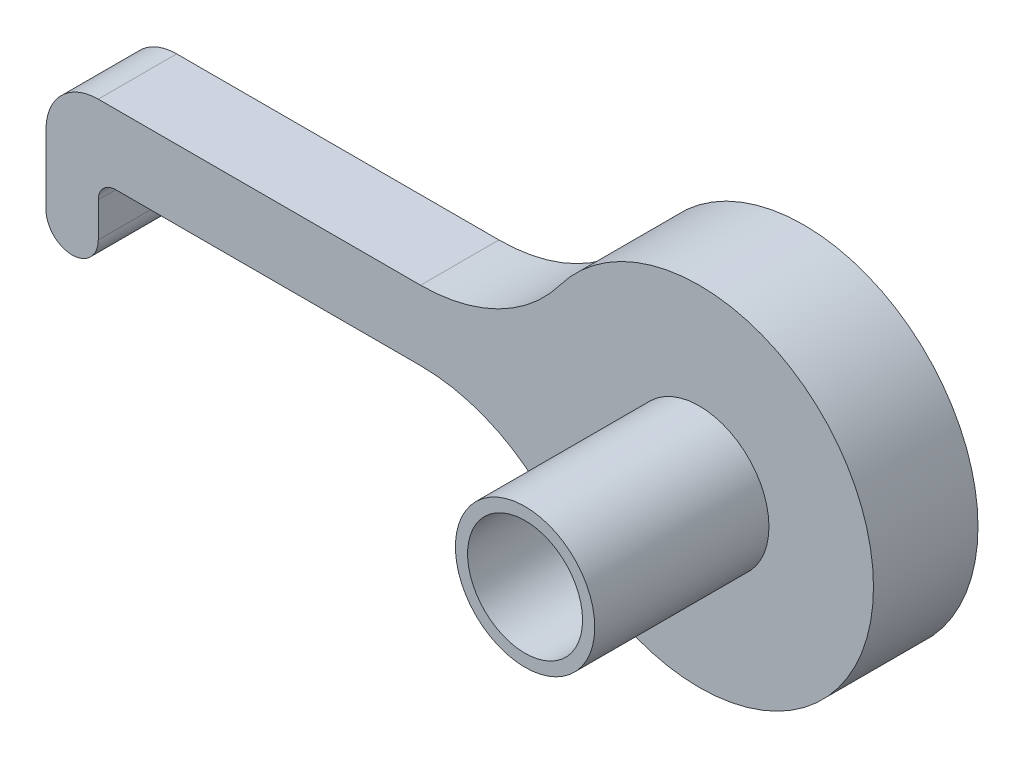
ISO-10303-21;
HEADER;
FILE_DESCRIPTION(('STEP AP214'),'2;1');
FILE_NAME('part.step','',(''),(''),'','','');
FILE_SCHEMA(('AUTOMOTIVE_DESIGN { 1 0 10303 214 1 1 1 1 }'));
ENDSEC;
DATA;
#1=APPLICATION_CONTEXT('core data for automotive mechanical design processes');
#2=APPLICATION_PROTOCOL_DEFINITION('international standard','automotive_design',2000,#1);
#3=PRODUCT_CONTEXT('',#1,'mechanical');
#4=PRODUCT('Part','Part','',(#3));
#5=PRODUCT_RELATED_PRODUCT_CATEGORY('part','',(#4));
#6=PRODUCT_DEFINITION_FORMATION('','',#4);
#7=PRODUCT_DEFINITION_CONTEXT('part definition',#1,'design');
#8=PRODUCT_DEFINITION('design','',#6,#7);
#9=PRODUCT_DEFINITION_SHAPE('','',#8);
#10=(LENGTH_UNIT() NAMED_UNIT(*) SI_UNIT(.MILLI.,.METRE.));
#11=(NAMED_UNIT(*) PLANE_ANGLE_UNIT() SI_UNIT($,.RADIAN.));
#12=(NAMED_UNIT(*) SI_UNIT($,.STERADIAN.) SOLID_ANGLE_UNIT());
#13=UNCERTAINTY_MEASURE_WITH_UNIT(LENGTH_MEASURE(1.E-05),#10,'distance_accuracy_value','');
#14=(GEOMETRIC_REPRESENTATION_CONTEXT(3) GLOBAL_UNCERTAINTY_ASSIGNED_CONTEXT((#13)) GLOBAL_UNIT_ASSIGNED_CONTEXT((#10,
#11,#12)) REPRESENTATION_CONTEXT('',''));
#15=CARTESIAN_POINT('',(0.,0.,0.));
#16=DIRECTION('',(0.,0.,1.));
#17=DIRECTION('',(1.,0.,0.));
#18=AXIS2_PLACEMENT_3D('',#15,#16,#17);
#19=CARTESIAN_POINT('',(0.,0.,6.));
#20=DIRECTION('',(0.,0.,-1.));
#21=DIRECTION('',(-1.,0.,0.));
#22=AXIS2_PLACEMENT_3D('',#19,#20,#21);
#23=CYLINDRICAL_SURFACE('',#22,10.);
#24=CARTESIAN_POINT('',(0.,0.,6.));
#25=DIRECTION('',(0.,0.,1.));
#26=DIRECTION('',(1.,0.,0.));
#27=AXIS2_PLACEMENT_3D('',#24,#25,#26);
#28=CIRCLE('',#27,10.);
#29=CARTESIAN_POINT('',(-8.,-6.,6.));
#30=VERTEX_POINT('',#29);
#31=CARTESIAN_POINT('',(-8.,6.,6.));
#32=VERTEX_POINT('',#31);
#33=EDGE_CURVE('E188',#30,#32,#28,.T.);
#34=ORIENTED_EDGE('',*,*,#33,.F.);
#35=DIRECTION('',(0.,0.,-1.));
#36=VECTOR('',#35,1.);
#37=CARTESIAN_POINT('',(-8.,-6.,6.));
#38=LINE('',#37,#36);
#39=CARTESIAN_POINT('',(-8.,-6.,1.5));
#40=VERTEX_POINT('',#39);
#41=EDGE_CURVE('E227',#30,#40,#38,.T.);
#42=ORIENTED_EDGE('',*,*,#41,.T.);
#43=CARTESIAN_POINT('',(0.,0.,1.5));
#44=DIRECTION('',(0.,0.,-1.));
#45=DIRECTION('',(1.,0.,0.));
#46=AXIS2_PLACEMENT_3D('',#43,#44,#45);
#47=CIRCLE('',#46,10.);
#48=CARTESIAN_POINT('',(-8.,6.,1.5));
#49=VERTEX_POINT('',#48);
#50=EDGE_CURVE('E165',#40,#49,#47,.T.);
#51=ORIENTED_EDGE('',*,*,#50,.T.);
#52=DIRECTION('',(0.,0.,-1.));
#53=VECTOR('',#52,1.);
#54=CARTESIAN_POINT('',(-8.,6.,6.));
#55=LINE('',#54,#53);
#56=EDGE_CURVE('E223',#49,#32,#55,.F.);
#57=ORIENTED_EDGE('',*,*,#56,.T.);
#58=EDGE_LOOP('',(#34,#42,#51,#57));
#59=FACE_BOUND('',#58,.T.);
#60=CARTESIAN_POINT('',(0.,0.,0.));
#61=DIRECTION('',(0.,0.,1.));
#62=DIRECTION('',(1.,0.,0.));
#63=AXIS2_PLACEMENT_3D('',#60,#61,#62);
#64=CIRCLE('',#63,10.);
#65=CARTESIAN_POINT('',(10.,0.,0.));
#66=VERTEX_POINT('',#65);
#67=EDGE_CURVE('E186',#66,#66,#64,.T.);
#68=ORIENTED_EDGE('',*,*,#67,.T.);
#69=EDGE_LOOP('',(#68));
#70=FACE_BOUND('',#69,.T.);
#71=ADVANCED_FACE('F45',(#59,#70),#23,.T.);
#72=CARTESIAN_POINT('',(0.,0.,6.));
#73=DIRECTION('',(0.,0.,1.));
#74=DIRECTION('',(1.,0.,0.));
#75=AXIS2_PLACEMENT_3D('',#72,#73,#74);
#76=PLANE('',#75);
#77=CARTESIAN_POINT('',(0.,0.,6.));
#78=DIRECTION('',(0.,0.,1.));
#79=DIRECTION('',(1.,0.,0.));
#80=AXIS2_PLACEMENT_3D('',#77,#78,#79);
#81=CIRCLE('',#80,4.);
#82=CARTESIAN_POINT('',(4.,0.,6.));
#83=VERTEX_POINT('',#82);
#84=EDGE_CURVE('E12',#83,#83,#81,.T.);
#85=ORIENTED_EDGE('',*,*,#84,.F.);
#86=EDGE_LOOP('',(#85));
#87=FACE_BOUND('',#86,.T.);
#88=ORIENTED_EDGE('',*,*,#33,.T.);
#89=CARTESIAN_POINT('',(-16.,12.,6.));
#90=DIRECTION('',(0.,0.,1.));
#91=DIRECTION('',(1.,0.,0.));
#92=AXIS2_PLACEMENT_3D('',#89,#90,#91);
#93=CIRCLE('',#92,10.);
#94=CARTESIAN_POINT('',(-16.,2.,6.));
#95=VERTEX_POINT('',#94);
#96=EDGE_CURVE('E62',#32,#95,#93,.F.);
#97=ORIENTED_EDGE('',*,*,#96,.T.);
#98=DIRECTION('',(-1.,0.,0.));
#99=VECTOR('',#98,1.);
#100=CARTESIAN_POINT('',(-9.79795897113271,2.,6.));
#101=LINE('',#100,#99);
#102=CARTESIAN_POINT('',(-34.5,2.,6.));
#103=VERTEX_POINT('',#102);
#104=EDGE_CURVE('E158',#95,#103,#101,.T.);
#105=ORIENTED_EDGE('',*,*,#104,.T.);
#106=CARTESIAN_POINT('',(-34.5,-1.,6.));
#107=DIRECTION('',(0.,0.,1.));
#108=DIRECTION('',(1.,0.,0.));
#109=AXIS2_PLACEMENT_3D('',#106,#107,#108);
#110=CIRCLE('',#109,3.);
#111=CARTESIAN_POINT('',(-37.5,-1.,6.));
#112=VERTEX_POINT('',#111);
#113=EDGE_CURVE('E198',#103,#112,#110,.T.);
#114=ORIENTED_EDGE('',*,*,#113,.T.);
#115=DIRECTION('',(0.,-1.,0.));
#116=VECTOR('',#115,1.);
#117=CARTESIAN_POINT('',(-37.5,-5.,6.));
#118=LINE('',#117,#116);
#119=CARTESIAN_POINT('',(-37.5,-5.,6.));
#120=VERTEX_POINT('',#119);
#121=EDGE_CURVE('E155',#112,#120,#118,.T.);
#122=ORIENTED_EDGE('',*,*,#121,.T.);
#123=CARTESIAN_POINT('',(-36.,-5.,6.));
#124=DIRECTION('',(0.,0.,1.));
#125=DIRECTION('',(1.,0.,0.));
#126=AXIS2_PLACEMENT_3D('',#123,#124,#125);
#127=CIRCLE('',#126,1.5);
#128=CARTESIAN_POINT('',(-34.5,-5.,6.));
#129=VERTEX_POINT('',#128);
#130=EDGE_CURVE('E173',#120,#129,#127,.T.);
#131=ORIENTED_EDGE('',*,*,#130,.T.);
#132=DIRECTION('',(0.,1.,0.));
#133=VECTOR('',#132,1.);
#134=CARTESIAN_POINT('',(-34.5,-5.,6.));
#135=LINE('',#134,#133);
#136=CARTESIAN_POINT('',(-34.5,-3.00000000000001,6.));
#137=VERTEX_POINT('',#136);
#138=EDGE_CURVE('E131',#129,#137,#135,.T.);
#139=ORIENTED_EDGE('',*,*,#138,.T.);
#140=CARTESIAN_POINT('',(-33.5,-3.,6.));
#141=DIRECTION('',(0.,0.,1.));
#142=DIRECTION('',(1.,0.,0.));
#143=AXIS2_PLACEMENT_3D('',#140,#141,#142);
#144=CIRCLE('',#143,1.);
#145=CARTESIAN_POINT('',(-33.5,-2.,6.));
#146=VERTEX_POINT('',#145);
#147=EDGE_CURVE('E214',#137,#146,#144,.F.);
#148=ORIENTED_EDGE('',*,*,#147,.T.);
#149=DIRECTION('',(1.,0.,0.));
#150=VECTOR('',#149,1.);
#151=CARTESIAN_POINT('',(-9.79795897113271,-2.,6.));
#152=LINE('',#151,#150);
#153=CARTESIAN_POINT('',(-16.,-2.,6.));
#154=VERTEX_POINT('',#153);
#155=EDGE_CURVE('E179',#146,#154,#152,.T.);
#156=ORIENTED_EDGE('',*,*,#155,.T.);
#157=CARTESIAN_POINT('',(-16.,-12.,6.));
#158=DIRECTION('',(0.,0.,1.));
#159=DIRECTION('',(1.,0.,0.));
#160=AXIS2_PLACEMENT_3D('',#157,#158,#159);
#161=CIRCLE('',#160,10.);
#162=EDGE_CURVE('E233',#154,#30,#161,.F.);
#163=ORIENTED_EDGE('',*,*,#162,.T.);
#164=EDGE_LOOP('',(#88,#97,#105,#114,#122,#131,#139,#148,#156,#163));
#165=FACE_BOUND('',#164,.T.);
#166=ADVANCED_FACE('F248',(#87,#165),#76,.T.);
#167=CARTESIAN_POINT('',(0.,0.,0.));
#168=DIRECTION('',(0.,0.,1.));
#169=DIRECTION('',(1.,0.,0.));
#170=AXIS2_PLACEMENT_3D('',#167,#168,#169);
#171=PLANE('',#170);
#172=ORIENTED_EDGE('',*,*,#67,.F.);
#173=EDGE_LOOP('',(#172));
#174=FACE_BOUND('',#173,.T.);
#175=ADVANCED_FACE('F282',(#174),#171,.F.);
#176=CARTESIAN_POINT('',(-36.,-5.,1.5));
#177=DIRECTION('',(0.,0.,1.));
#178=DIRECTION('',(1.,0.,0.));
#179=AXIS2_PLACEMENT_3D('',#176,#177,#178);
#180=CYLINDRICAL_SURFACE('',#179,1.5);
#181=ORIENTED_EDGE('',*,*,#130,.F.);
#182=DIRECTION('',(0.,0.,1.));
#183=VECTOR('',#182,1.);
#184=CARTESIAN_POINT('',(-37.5,-5.,1.5));
#185=LINE('',#184,#183);
#186=CARTESIAN_POINT('',(-37.5,-5.,1.5));
#187=VERTEX_POINT('',#186);
#188=EDGE_CURVE('E137',#187,#120,#185,.T.);
#189=ORIENTED_EDGE('',*,*,#188,.F.);
#190=CARTESIAN_POINT('',(-36.,-5.,1.5));
#191=DIRECTION('',(0.,0.,1.));
#192=DIRECTION('',(1.,0.,0.));
#193=AXIS2_PLACEMENT_3D('',#190,#191,#192);
#194=CIRCLE('',#193,1.5);
#195=CARTESIAN_POINT('',(-34.5,-5.,1.5));
#196=VERTEX_POINT('',#195);
#197=EDGE_CURVE('E144',#187,#196,#194,.T.);
#198=ORIENTED_EDGE('',*,*,#197,.T.);
#199=DIRECTION('',(0.,0.,1.));
#200=VECTOR('',#199,1.);
#201=CARTESIAN_POINT('',(-34.5,-5.,1.5));
#202=LINE('',#201,#200);
#203=EDGE_CURVE('E124',#196,#129,#202,.T.);
#204=ORIENTED_EDGE('',*,*,#203,.T.);
#205=EDGE_LOOP('',(#181,#189,#198,#204));
#206=FACE_BOUND('',#205,.T.);
#207=ADVANCED_FACE('F152',(#206),#180,.T.);
#208=CARTESIAN_POINT('',(-37.5,-5.,1.5));
#209=DIRECTION('',(-1.,0.,0.));
#210=DIRECTION('',(0.,0.,1.));
#211=AXIS2_PLACEMENT_3D('',#208,#209,#210);
#212=PLANE('',#211);
#213=ORIENTED_EDGE('',*,*,#121,.F.);
#214=DIRECTION('',(0.,0.,1.));
#215=VECTOR('',#214,1.);
#216=CARTESIAN_POINT('',(-37.5,-1.,1.5));
#217=LINE('',#216,#215);
#218=CARTESIAN_POINT('',(-37.5,-1.,1.5));
#219=VERTEX_POINT('',#218);
#220=EDGE_CURVE('E201',#112,#219,#217,.F.);
#221=ORIENTED_EDGE('',*,*,#220,.T.);
#222=DIRECTION('',(0.,-1.,0.));
#223=VECTOR('',#222,1.);
#224=CARTESIAN_POINT('',(-37.5,-5.,1.5));
#225=LINE('',#224,#223);
#226=EDGE_CURVE('E138',#219,#187,#225,.T.);
#227=ORIENTED_EDGE('',*,*,#226,.T.);
#228=ORIENTED_EDGE('',*,*,#188,.T.);
#229=EDGE_LOOP('',(#213,#221,#227,#228));
#230=FACE_BOUND('',#229,.T.);
#231=ADVANCED_FACE('F263',(#230),#212,.T.);
#232=CARTESIAN_POINT('',(-9.79795897113271,2.,1.5));
#233=DIRECTION('',(0.,1.,0.));
#234=DIRECTION('',(-1.,0.,0.));
#235=AXIS2_PLACEMENT_3D('',#232,#233,#234);
#236=PLANE('',#235);
#237=ORIENTED_EDGE('',*,*,#104,.F.);
#238=DIRECTION('',(0.,0.,-1.));
#239=VECTOR('',#238,1.);
#240=CARTESIAN_POINT('',(-16.,2.,1.5));
#241=LINE('',#240,#239);
#242=CARTESIAN_POINT('',(-16.,2.,1.5));
#243=VERTEX_POINT('',#242);
#244=EDGE_CURVE('E69',#95,#243,#241,.T.);
#245=ORIENTED_EDGE('',*,*,#244,.T.);
#246=DIRECTION('',(-1.,0.,0.));
#247=VECTOR('',#246,1.);
#248=CARTESIAN_POINT('',(-9.79795897113271,2.,1.5));
#249=LINE('',#248,#247);
#250=CARTESIAN_POINT('',(-34.5,2.,1.5));
#251=VERTEX_POINT('',#250);
#252=EDGE_CURVE('E168',#243,#251,#249,.T.);
#253=ORIENTED_EDGE('',*,*,#252,.T.);
#254=DIRECTION('',(0.,0.,1.));
#255=VECTOR('',#254,1.);
#256=CARTESIAN_POINT('',(-34.5,2.,1.5));
#257=LINE('',#256,#255);
#258=EDGE_CURVE('E191',#251,#103,#257,.T.);
#259=ORIENTED_EDGE('',*,*,#258,.T.);
#260=EDGE_LOOP('',(#237,#245,#253,#259));
#261=FACE_BOUND('',#260,.T.);
#262=ADVANCED_FACE('F268',(#261),#236,.T.);
#263=CARTESIAN_POINT('',(-9.79795897113271,-2.,1.5));
#264=DIRECTION('',(0.,-1.,0.));
#265=DIRECTION('',(1.,0.,0.));
#266=AXIS2_PLACEMENT_3D('',#263,#264,#265);
#267=PLANE('',#266);
#268=DIRECTION('',(1.,0.,0.));
#269=VECTOR('',#268,1.);
#270=CARTESIAN_POINT('',(-9.79795897113271,-2.,1.5));
#271=LINE('',#270,#269);
#272=CARTESIAN_POINT('',(-33.5,-2.,1.5));
#273=VERTEX_POINT('',#272);
#274=CARTESIAN_POINT('',(-16.,-2.,1.5));
#275=VERTEX_POINT('',#274);
#276=EDGE_CURVE('E149',#273,#275,#271,.T.);
#277=ORIENTED_EDGE('',*,*,#276,.T.);
#278=DIRECTION('',(0.,0.,-1.));
#279=VECTOR('',#278,1.);
#280=CARTESIAN_POINT('',(-16.,-2.,1.5));
#281=LINE('',#280,#279);
#282=EDGE_CURVE('E219',#275,#154,#281,.F.);
#283=ORIENTED_EDGE('',*,*,#282,.T.);
#284=ORIENTED_EDGE('',*,*,#155,.F.);
#285=DIRECTION('',(0.,0.,1.));
#286=VECTOR('',#285,1.);
#287=CARTESIAN_POINT('',(-33.5,-2.,1.5));
#288=LINE('',#287,#286);
#289=EDGE_CURVE('E211',#146,#273,#288,.F.);
#290=ORIENTED_EDGE('',*,*,#289,.T.);
#291=EDGE_LOOP('',(#277,#283,#284,#290));
#292=FACE_BOUND('',#291,.T.);
#293=ADVANCED_FACE('F255',(#292),#267,.T.);
#294=CARTESIAN_POINT('',(-34.5,-5.,1.5));
#295=DIRECTION('',(1.,0.,0.));
#296=DIRECTION('',(0.,0.,-1.));
#297=AXIS2_PLACEMENT_3D('',#294,#295,#296);
#298=PLANE('',#297);
#299=DIRECTION('',(0.,1.,0.));
#300=VECTOR('',#299,1.);
#301=CARTESIAN_POINT('',(-34.5,-5.,1.5));
#302=LINE('',#301,#300);
#303=CARTESIAN_POINT('',(-34.5,-3.00000000000001,1.5));
#304=VERTEX_POINT('',#303);
#305=EDGE_CURVE('E128',#196,#304,#302,.T.);
#306=ORIENTED_EDGE('',*,*,#305,.T.);
#307=DIRECTION('',(0.,0.,1.));
#308=VECTOR('',#307,1.);
#309=CARTESIAN_POINT('',(-34.5,-3.,6.));
#310=LINE('',#309,#308);
#311=EDGE_CURVE('E208',#304,#137,#310,.T.);
#312=ORIENTED_EDGE('',*,*,#311,.T.);
#313=ORIENTED_EDGE('',*,*,#138,.F.);
#314=ORIENTED_EDGE('',*,*,#203,.F.);
#315=EDGE_LOOP('',(#306,#312,#313,#314));
#316=FACE_BOUND('',#315,.T.);
#317=ADVANCED_FACE('F126',(#316),#298,.T.);
#318=CARTESIAN_POINT('',(-36.,-5.,1.5));
#319=DIRECTION('',(0.,0.,1.));
#320=DIRECTION('',(1.,0.,0.));
#321=AXIS2_PLACEMENT_3D('',#318,#319,#320);
#322=PLANE('',#321);
#323=ORIENTED_EDGE('',*,*,#226,.F.);
#324=CARTESIAN_POINT('',(-34.5,-1.,1.5));
#325=DIRECTION('',(0.,0.,1.));
#326=DIRECTION('',(1.,0.,0.));
#327=AXIS2_PLACEMENT_3D('',#324,#325,#326);
#328=CIRCLE('',#327,3.);
#329=EDGE_CURVE('E204',#219,#251,#328,.F.);
#330=ORIENTED_EDGE('',*,*,#329,.T.);
#331=ORIENTED_EDGE('',*,*,#252,.F.);
#332=CARTESIAN_POINT('',(-16.,12.,1.5));
#333=DIRECTION('',(0.,0.,1.));
#334=DIRECTION('',(1.,0.,0.));
#335=AXIS2_PLACEMENT_3D('',#332,#333,#334);
#336=CIRCLE('',#335,10.);
#337=EDGE_CURVE('E49',#243,#49,#336,.T.);
#338=ORIENTED_EDGE('',*,*,#337,.T.);
#339=ORIENTED_EDGE('',*,*,#50,.F.);
#340=CARTESIAN_POINT('',(-16.,-12.,1.5));
#341=DIRECTION('',(0.,0.,1.));
#342=DIRECTION('',(1.,0.,0.));
#343=AXIS2_PLACEMENT_3D('',#340,#341,#342);
#344=CIRCLE('',#343,10.);
#345=EDGE_CURVE('E236',#40,#275,#344,.T.);
#346=ORIENTED_EDGE('',*,*,#345,.T.);
#347=ORIENTED_EDGE('',*,*,#276,.F.);
#348=CARTESIAN_POINT('',(-33.5,-3.,1.5));
#349=DIRECTION('',(0.,0.,1.));
#350=DIRECTION('',(1.,0.,0.));
#351=AXIS2_PLACEMENT_3D('',#348,#349,#350);
#352=CIRCLE('',#351,1.);
#353=EDGE_CURVE('E147',#273,#304,#352,.T.);
#354=ORIENTED_EDGE('',*,*,#353,.T.);
#355=ORIENTED_EDGE('',*,*,#305,.F.);
#356=ORIENTED_EDGE('',*,*,#197,.F.);
#357=EDGE_LOOP('',(#323,#330,#331,#338,#339,#346,#347,#354,#355,#356));
#358=FACE_BOUND('',#357,.T.);
#359=ADVANCED_FACE('F143',(#358),#322,.F.);
#360=CARTESIAN_POINT('',(-34.5,-1.,1.5));
#361=DIRECTION('',(0.,0.,1.));
#362=DIRECTION('',(1.,0.,0.));
#363=AXIS2_PLACEMENT_3D('',#360,#361,#362);
#364=CYLINDRICAL_SURFACE('',#363,3.);
#365=ORIENTED_EDGE('',*,*,#329,.F.);
#366=ORIENTED_EDGE('',*,*,#220,.F.);
#367=ORIENTED_EDGE('',*,*,#113,.F.);
#368=ORIENTED_EDGE('',*,*,#258,.F.);
#369=EDGE_LOOP('',(#365,#366,#367,#368));
#370=FACE_BOUND('',#369,.T.);
#371=ADVANCED_FACE('F267',(#370),#364,.T.);
#372=CARTESIAN_POINT('',(-33.5,-3.,1.5));
#373=DIRECTION('',(0.,0.,-1.));
#374=DIRECTION('',(-1.,0.,0.));
#375=AXIS2_PLACEMENT_3D('',#372,#373,#374);
#376=CYLINDRICAL_SURFACE('',#375,1.);
#377=ORIENTED_EDGE('',*,*,#353,.F.);
#378=ORIENTED_EDGE('',*,*,#289,.F.);
#379=ORIENTED_EDGE('',*,*,#147,.F.);
#380=ORIENTED_EDGE('',*,*,#311,.F.);
#381=EDGE_LOOP('',(#377,#378,#379,#380));
#382=FACE_BOUND('',#381,.T.);
#383=ADVANCED_FACE('F258',(#382),#376,.F.);
#384=CARTESIAN_POINT('',(-16.,-12.,6.));
#385=DIRECTION('',(0.,0.,-1.));
#386=DIRECTION('',(-1.,0.,0.));
#387=AXIS2_PLACEMENT_3D('',#384,#385,#386);
#388=CYLINDRICAL_SURFACE('',#387,10.);
#389=ORIENTED_EDGE('',*,*,#345,.F.);
#390=ORIENTED_EDGE('',*,*,#41,.F.);
#391=ORIENTED_EDGE('',*,*,#162,.F.);
#392=ORIENTED_EDGE('',*,*,#282,.F.);
#393=EDGE_LOOP('',(#389,#390,#391,#392));
#394=FACE_BOUND('',#393,.T.);
#395=ADVANCED_FACE('F253',(#394),#388,.F.);
#396=CARTESIAN_POINT('',(-16.,12.,6.));
#397=DIRECTION('',(0.,0.,-1.));
#398=DIRECTION('',(-1.,0.,0.));
#399=AXIS2_PLACEMENT_3D('',#396,#397,#398);
#400=CYLINDRICAL_SURFACE('',#399,10.);
#401=ORIENTED_EDGE('',*,*,#337,.F.);
#402=ORIENTED_EDGE('',*,*,#244,.F.);
#403=ORIENTED_EDGE('',*,*,#96,.F.);
#404=ORIENTED_EDGE('',*,*,#56,.F.);
#405=EDGE_LOOP('',(#401,#402,#403,#404));
#406=FACE_BOUND('',#405,.T.);
#407=ADVANCED_FACE('F47',(#406),#400,.F.);
#408=CARTESIAN_POINT('',(0.,0.,16.));
#409=DIRECTION('',(0.,0.,-1.));
#410=DIRECTION('',(-1.,0.,0.));
#411=AXIS2_PLACEMENT_3D('',#408,#409,#410);
#412=CYLINDRICAL_SURFACE('',#411,4.);
#413=CARTESIAN_POINT('',(0.,0.,16.));
#414=DIRECTION('',(0.,0.,1.));
#415=DIRECTION('',(1.,0.,0.));
#416=AXIS2_PLACEMENT_3D('',#413,#414,#415);
#417=CIRCLE('',#416,4.);
#418=CARTESIAN_POINT('',(4.,0.,16.));
#419=VERTEX_POINT('',#418);
#420=EDGE_CURVE('E176',#419,#419,#417,.T.);
#421=ORIENTED_EDGE('',*,*,#420,.F.);
#422=EDGE_LOOP('',(#421));
#423=FACE_BOUND('',#422,.T.);
#424=ORIENTED_EDGE('',*,*,#84,.T.);
#425=EDGE_LOOP('',(#424));
#426=FACE_BOUND('',#425,.T.);
#427=ADVANCED_FACE('F294',(#423,#426),#412,.T.);
#428=CARTESIAN_POINT('',(0.,0.,16.));
#429=DIRECTION('',(0.,0.,1.));
#430=DIRECTION('',(1.,0.,0.));
#431=AXIS2_PLACEMENT_3D('',#428,#429,#430);
#432=PLANE('',#431);
#433=CARTESIAN_POINT('',(0.,0.,16.));
#434=DIRECTION('',(0.,0.,1.));
#435=DIRECTION('',(1.,0.,0.));
#436=AXIS2_PLACEMENT_3D('',#433,#434,#435);
#437=CIRCLE('',#436,3.3);
#438=CARTESIAN_POINT('',(3.3,0.,16.));
#439=VERTEX_POINT('',#438);
#440=EDGE_CURVE('E458',#439,#439,#437,.T.);
#441=ORIENTED_EDGE('',*,*,#440,.F.);
#442=EDGE_LOOP('',(#441));
#443=FACE_BOUND('',#442,.T.);
#444=ORIENTED_EDGE('',*,*,#420,.T.);
#445=EDGE_LOOP('',(#444));
#446=FACE_BOUND('',#445,.T.);
#447=ADVANCED_FACE('F298',(#443,#446),#432,.T.);
#448=CARTESIAN_POINT('',(0.,0.,-9.33380951166243));
#449=DIRECTION('',(0.,0.,1.));
#450=DIRECTION('',(1.,0.,0.));
#451=AXIS2_PLACEMENT_3D('',#448,#449,#450);
#452=CYLINDRICAL_SURFACE('',#451,3.3);
#453=CARTESIAN_POINT('',(0.,0.,2.));
#454=DIRECTION('',(0.,0.,1.));
#455=DIRECTION('',(1.,0.,0.));
#456=AXIS2_PLACEMENT_3D('',#453,#454,#455);
#457=CIRCLE('',#456,3.3);
#458=CARTESIAN_POINT('',(3.3,0.,2.));
#459=VERTEX_POINT('',#458);
#460=EDGE_CURVE('E456',#459,#459,#457,.F.);
#461=ORIENTED_EDGE('',*,*,#460,.T.);
#462=EDGE_LOOP('',(#461));
#463=FACE_BOUND('',#462,.T.);
#464=ORIENTED_EDGE('',*,*,#440,.T.);
#465=EDGE_LOOP('',(#464));
#466=FACE_BOUND('',#465,.T.);
#467=ADVANCED_FACE('F304',(#463,#466),#452,.F.);
#468=CARTESIAN_POINT('',(0.,0.,2.));
#469=DIRECTION('',(0.,0.,1.));
#470=DIRECTION('',(1.,0.,0.));
#471=AXIS2_PLACEMENT_3D('',#468,#469,#470);
#472=PLANE('',#471);
#473=ORIENTED_EDGE('',*,*,#460,.F.);
#474=EDGE_LOOP('',(#473));
#475=FACE_BOUND('',#474,.T.);
#476=ADVANCED_FACE('F356',(#475),#472,.T.);
#477=CLOSED_SHELL('',(#71,#166,#175,#207,#231,#262,#293,#317,#359,#371,#383,#395,#407,#427,#447,
#467,#476));
#478=MANIFOLD_SOLID_BREP('B2',#477);
#479=ADVANCED_BREP_SHAPE_REPRESENTATION('',(#18,#478),#14);
#480=SHAPE_DEFINITION_REPRESENTATION(#9,#479);
ENDSEC;
END-ISO-10303-21;
